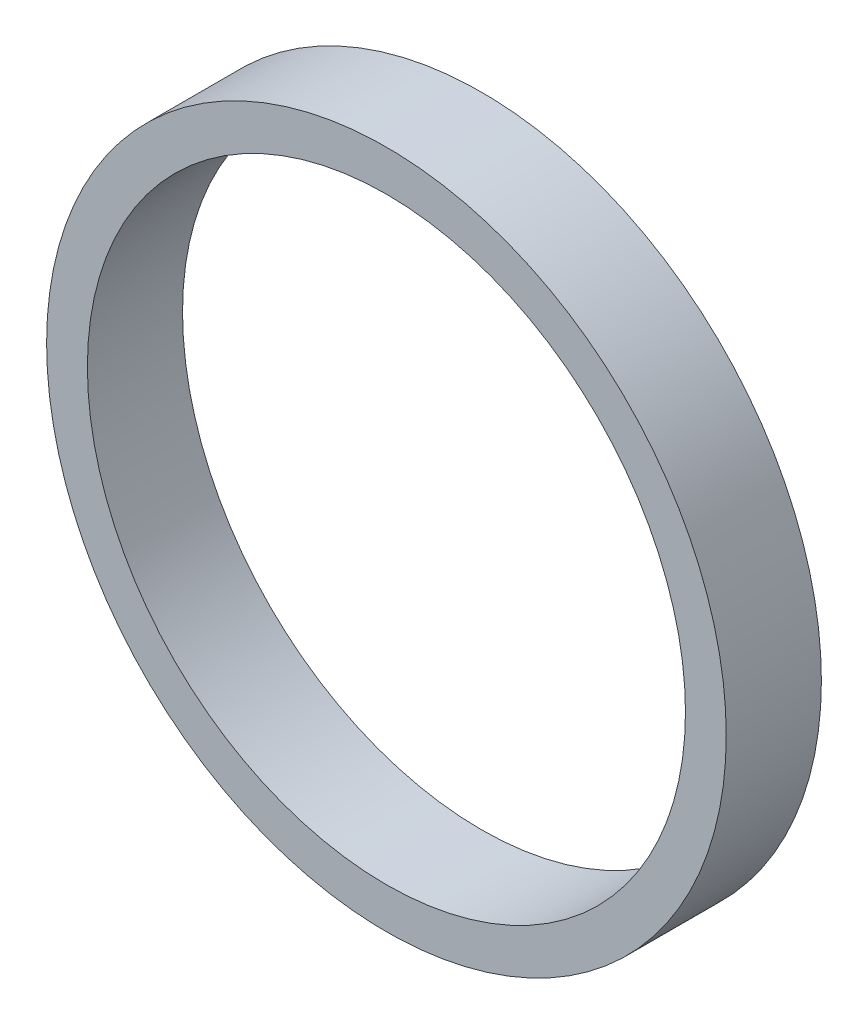
ISO-10303-21;
HEADER;
FILE_DESCRIPTION(('STEP AP214'),'2;1');
FILE_NAME('part.step','',(''),(''),'','','');
FILE_SCHEMA(('AUTOMOTIVE_DESIGN { 1 0 10303 214 1 1 1 1 }'));
ENDSEC;
DATA;
#1=APPLICATION_CONTEXT('core data for automotive mechanical design processes');
#2=APPLICATION_PROTOCOL_DEFINITION('international standard','automotive_design',2000,#1);
#3=PRODUCT_CONTEXT('',#1,'mechanical');
#4=PRODUCT('Part','Part','',(#3));
#5=PRODUCT_RELATED_PRODUCT_CATEGORY('part','',(#4));
#6=PRODUCT_DEFINITION_FORMATION('','',#4);
#7=PRODUCT_DEFINITION_CONTEXT('part definition',#1,'design');
#8=PRODUCT_DEFINITION('design','',#6,#7);
#9=PRODUCT_DEFINITION_SHAPE('','',#8);
#10=(LENGTH_UNIT() NAMED_UNIT(*) SI_UNIT(.MILLI.,.METRE.));
#11=(NAMED_UNIT(*) PLANE_ANGLE_UNIT() SI_UNIT($,.RADIAN.));
#12=(NAMED_UNIT(*) SI_UNIT($,.STERADIAN.) SOLID_ANGLE_UNIT());
#13=UNCERTAINTY_MEASURE_WITH_UNIT(LENGTH_MEASURE(1.E-05),#10,'distance_accuracy_value','');
#14=(GEOMETRIC_REPRESENTATION_CONTEXT(3) GLOBAL_UNCERTAINTY_ASSIGNED_CONTEXT((#13)) GLOBAL_UNIT_ASSIGNED_CONTEXT((#10,
#11,#12)) REPRESENTATION_CONTEXT('',''));
#15=CARTESIAN_POINT('',(0.,0.,0.));
#16=DIRECTION('',(0.,0.,1.));
#17=DIRECTION('',(1.,0.,0.));
#18=AXIS2_PLACEMENT_3D('',#15,#16,#17);
#19=CARTESIAN_POINT('',(0.,0.,3.5));
#20=DIRECTION('',(0.,0.,-1.));
#21=DIRECTION('',(-1.,0.,0.));
#22=AXIS2_PLACEMENT_3D('',#19,#20,#21);
#23=CYLINDRICAL_SURFACE('',#22,12.5);
#24=CARTESIAN_POINT('',(0.,0.,3.5));
#25=DIRECTION('',(0.,0.,1.));
#26=DIRECTION('',(1.,0.,0.));
#27=AXIS2_PLACEMENT_3D('',#24,#25,#26);
#28=CIRCLE('',#27,12.5);
#29=CARTESIAN_POINT('',(12.5,0.,3.5));
#30=VERTEX_POINT('',#29);
#31=EDGE_CURVE('E10',#30,#30,#28,.T.);
#32=ORIENTED_EDGE('',*,*,#31,.F.);
#33=EDGE_LOOP('',(#32));
#34=FACE_BOUND('',#33,.T.);
#35=CARTESIAN_POINT('',(0.,0.,0.));
#36=DIRECTION('',(0.,0.,1.));
#37=DIRECTION('',(1.,0.,0.));
#38=AXIS2_PLACEMENT_3D('',#35,#36,#37);
#39=CIRCLE('',#38,12.5);
#40=CARTESIAN_POINT('',(12.5,0.,0.));
#41=VERTEX_POINT('',#40);
#42=EDGE_CURVE('E36',#41,#41,#39,.T.);
#43=ORIENTED_EDGE('',*,*,#42,.T.);
#44=EDGE_LOOP('',(#43));
#45=FACE_BOUND('',#44,.T.);
#46=ADVANCED_FACE('F33',(#34,#45),#23,.T.);
#47=CARTESIAN_POINT('',(0.,0.,3.5));
#48=DIRECTION('',(0.,0.,1.));
#49=DIRECTION('',(1.,0.,0.));
#50=AXIS2_PLACEMENT_3D('',#47,#48,#49);
#51=PLANE('',#50);
#52=CARTESIAN_POINT('',(0.,0.,3.5));
#53=DIRECTION('',(0.,0.,1.));
#54=DIRECTION('',(1.,0.,0.));
#55=AXIS2_PLACEMENT_3D('',#52,#53,#54);
#56=CIRCLE('',#55,11.);
#57=CARTESIAN_POINT('',(11.,0.,3.5));
#58=VERTEX_POINT('',#57);
#59=EDGE_CURVE('E45',#58,#58,#56,.T.);
#60=ORIENTED_EDGE('',*,*,#59,.F.);
#61=EDGE_LOOP('',(#60));
#62=FACE_BOUND('',#61,.T.);
#63=ORIENTED_EDGE('',*,*,#31,.T.);
#64=EDGE_LOOP('',(#63));
#65=FACE_BOUND('',#64,.T.);
#66=ADVANCED_FACE('F60',(#62,#65),#51,.T.);
#67=CARTESIAN_POINT('',(0.,0.,0.));
#68=DIRECTION('',(0.,0.,1.));
#69=DIRECTION('',(1.,0.,0.));
#70=AXIS2_PLACEMENT_3D('',#67,#68,#69);
#71=PLANE('',#70);
#72=CARTESIAN_POINT('',(0.,0.,0.));
#73=DIRECTION('',(0.,0.,1.));
#74=DIRECTION('',(1.,0.,0.));
#75=AXIS2_PLACEMENT_3D('',#72,#73,#74);
#76=CIRCLE('',#75,11.);
#77=CARTESIAN_POINT('',(11.,0.,0.));
#78=VERTEX_POINT('',#77);
#79=EDGE_CURVE('E43',#78,#78,#76,.T.);
#80=ORIENTED_EDGE('',*,*,#79,.T.);
#81=EDGE_LOOP('',(#80));
#82=FACE_BOUND('',#81,.T.);
#83=ORIENTED_EDGE('',*,*,#42,.F.);
#84=EDGE_LOOP('',(#83));
#85=FACE_BOUND('',#84,.T.);
#86=ADVANCED_FACE('F51',(#82,#85),#71,.F.);
#87=CARTESIAN_POINT('',(0.,0.,0.));
#88=DIRECTION('',(0.,0.,1.));
#89=DIRECTION('',(1.,0.,0.));
#90=AXIS2_PLACEMENT_3D('',#87,#88,#89);
#91=CYLINDRICAL_SURFACE('',#90,11.);
#92=ORIENTED_EDGE('',*,*,#79,.F.);
#93=EDGE_LOOP('',(#92));
#94=FACE_BOUND('',#93,.T.);
#95=ORIENTED_EDGE('',*,*,#59,.T.);
#96=EDGE_LOOP('',(#95));
#97=FACE_BOUND('',#96,.T.);
#98=ADVANCED_FACE('F54',(#94,#97),#91,.F.);
#99=CLOSED_SHELL('',(#46,#66,#86,#98));
#100=MANIFOLD_SOLID_BREP('B2',#99);
#101=ADVANCED_BREP_SHAPE_REPRESENTATION('',(#18,#100),#14);
#102=SHAPE_DEFINITION_REPRESENTATION(#9,#101);
ENDSEC;
END-ISO-10303-21;
